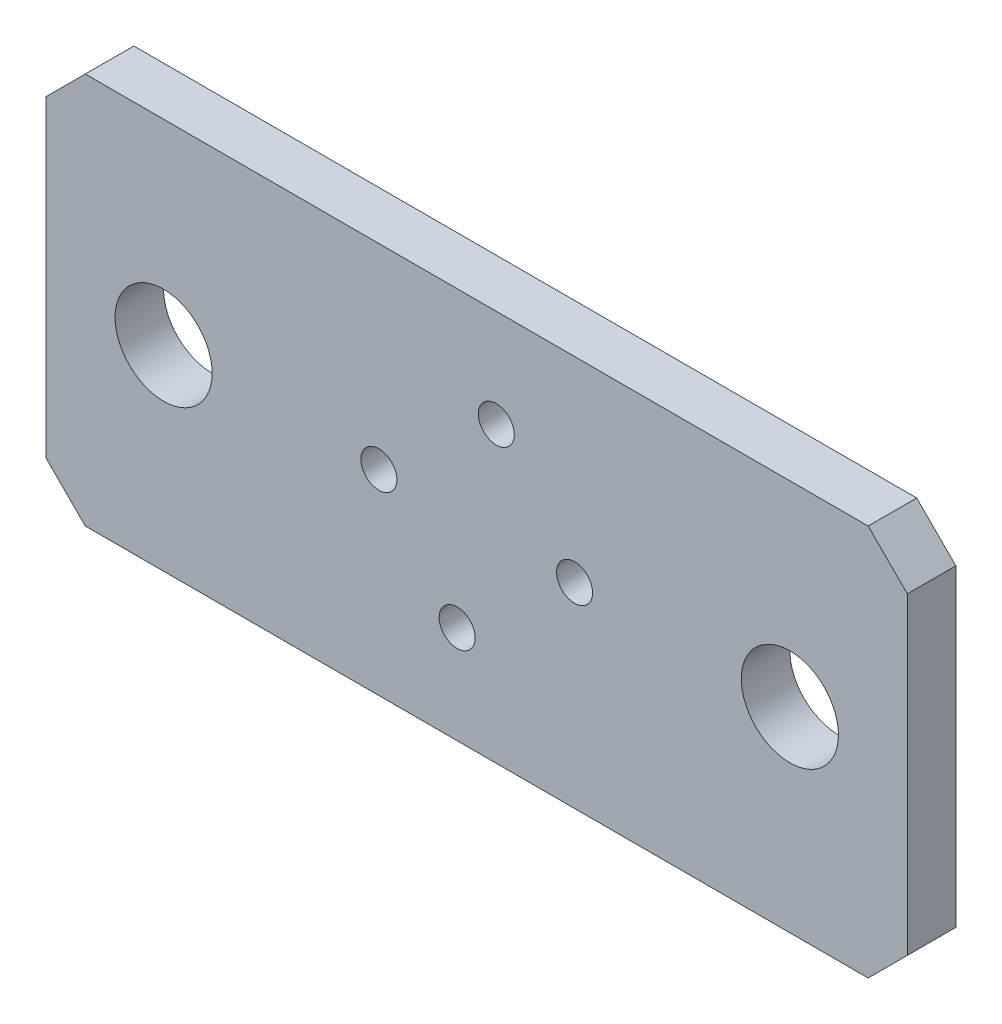
ISO-10303-21;
HEADER;
FILE_DESCRIPTION(('STEP AP214'),'2;1');
FILE_NAME('part.step','',(''),(''),'','','');
FILE_SCHEMA(('AUTOMOTIVE_DESIGN { 1 0 10303 214 1 1 1 1 }'));
ENDSEC;
DATA;
#1=APPLICATION_CONTEXT('core data for automotive mechanical design processes');
#2=APPLICATION_PROTOCOL_DEFINITION('international standard','automotive_design',2000,#1);
#3=PRODUCT_CONTEXT('',#1,'mechanical');
#4=PRODUCT('Part','Part','',(#3));
#5=PRODUCT_RELATED_PRODUCT_CATEGORY('part','',(#4));
#6=PRODUCT_DEFINITION_FORMATION('','',#4);
#7=PRODUCT_DEFINITION_CONTEXT('part definition',#1,'design');
#8=PRODUCT_DEFINITION('design','',#6,#7);
#9=PRODUCT_DEFINITION_SHAPE('','',#8);
#10=(LENGTH_UNIT() NAMED_UNIT(*) SI_UNIT(.MILLI.,.METRE.));
#11=(NAMED_UNIT(*) PLANE_ANGLE_UNIT() SI_UNIT($,.RADIAN.));
#12=(NAMED_UNIT(*) SI_UNIT($,.STERADIAN.) SOLID_ANGLE_UNIT());
#13=UNCERTAINTY_MEASURE_WITH_UNIT(LENGTH_MEASURE(1.E-05),#10,'distance_accuracy_value','');
#14=(GEOMETRIC_REPRESENTATION_CONTEXT(3) GLOBAL_UNCERTAINTY_ASSIGNED_CONTEXT((#13)) GLOBAL_UNIT_ASSIGNED_CONTEXT((#10,
#11,#12)) REPRESENTATION_CONTEXT('',''));
#15=CARTESIAN_POINT('',(0.,0.,0.));
#16=DIRECTION('',(0.,0.,1.));
#17=DIRECTION('',(1.,0.,0.));
#18=AXIS2_PLACEMENT_3D('',#15,#16,#17);
#19=CARTESIAN_POINT('',(0.,0.,1.5748));
#20=DIRECTION('',(0.,0.,-1.));
#21=DIRECTION('',(-1.,0.,0.));
#22=AXIS2_PLACEMENT_3D('',#19,#20,#21);
#23=PLANE('',#22);
#24=DIRECTION('',(0.,-1.,0.));
#25=VECTOR('',#24,1.);
#26=CARTESIAN_POINT('',(0.,1.27,1.5748));
#27=LINE('',#26,#25);
#28=CARTESIAN_POINT('',(0.,11.43,1.5748));
#29=VERTEX_POINT('',#28);
#30=CARTESIAN_POINT('',(0.,1.27,1.5748));
#31=VERTEX_POINT('',#30);
#32=EDGE_CURVE('E144',#29,#31,#27,.T.);
#33=ORIENTED_EDGE('',*,*,#32,.T.);
#34=DIRECTION('',(0.707106781186548,-0.707106781186548,0.));
#35=VECTOR('',#34,1.);
#36=CARTESIAN_POINT('',(1.27,0.,1.5748));
#37=LINE('',#36,#35);
#38=CARTESIAN_POINT('',(1.27,0.,1.5748));
#39=VERTEX_POINT('',#38);
#40=EDGE_CURVE('E92',#31,#39,#37,.T.);
#41=ORIENTED_EDGE('',*,*,#40,.T.);
#42=DIRECTION('',(1.,0.,0.));
#43=VECTOR('',#42,1.);
#44=CARTESIAN_POINT('',(26.67,0.,1.5748));
#45=LINE('',#44,#43);
#46=CARTESIAN_POINT('',(26.67,0.,1.5748));
#47=VERTEX_POINT('',#46);
#48=EDGE_CURVE('E159',#39,#47,#45,.T.);
#49=ORIENTED_EDGE('',*,*,#48,.T.);
#50=DIRECTION('',(0.707106781186548,0.707106781186547,0.));
#51=VECTOR('',#50,1.);
#52=CARTESIAN_POINT('',(27.94,1.27,1.5748));
#53=LINE('',#52,#51);
#54=CARTESIAN_POINT('',(27.94,1.27,1.5748));
#55=VERTEX_POINT('',#54);
#56=EDGE_CURVE('E172',#47,#55,#53,.T.);
#57=ORIENTED_EDGE('',*,*,#56,.T.);
#58=DIRECTION('',(0.,1.,0.));
#59=VECTOR('',#58,1.);
#60=CARTESIAN_POINT('',(27.94,11.43,1.5748));
#61=LINE('',#60,#59);
#62=CARTESIAN_POINT('',(27.94,11.43,1.5748));
#63=VERTEX_POINT('',#62);
#64=EDGE_CURVE('E111',#55,#63,#61,.T.);
#65=ORIENTED_EDGE('',*,*,#64,.T.);
#66=DIRECTION('',(-0.707106781186547,0.707106781186548,0.));
#67=VECTOR('',#66,1.);
#68=CARTESIAN_POINT('',(26.67,12.7,1.5748));
#69=LINE('',#68,#67);
#70=CARTESIAN_POINT('',(26.67,12.7,1.5748));
#71=VERTEX_POINT('',#70);
#72=EDGE_CURVE('E105',#63,#71,#69,.T.);
#73=ORIENTED_EDGE('',*,*,#72,.T.);
#74=DIRECTION('',(-1.,0.,0.));
#75=VECTOR('',#74,1.);
#76=CARTESIAN_POINT('',(1.27,12.7,1.5748));
#77=LINE('',#76,#75);
#78=CARTESIAN_POINT('',(1.27,12.7,1.5748));
#79=VERTEX_POINT('',#78);
#80=EDGE_CURVE('E109',#71,#79,#77,.T.);
#81=ORIENTED_EDGE('',*,*,#80,.T.);
#82=DIRECTION('',(-0.707106781186547,-0.707106781186548,0.));
#83=VECTOR('',#82,1.);
#84=CARTESIAN_POINT('',(0.,11.43,1.5748));
#85=LINE('',#84,#83);
#86=EDGE_CURVE('E49',#79,#29,#85,.T.);
#87=ORIENTED_EDGE('',*,*,#86,.T.);
#88=EDGE_LOOP('',(#33,#41,#49,#57,#65,#73,#81,#87));
#89=FACE_BOUND('',#88,.T.);
#90=CARTESIAN_POINT('',(10.795,6.35,1.5748));
#91=DIRECTION('',(0.,0.,1.));
#92=DIRECTION('',(1.,0.,0.));
#93=AXIS2_PLACEMENT_3D('',#90,#91,#92);
#94=CIRCLE('',#93,0.5842);
#95=CARTESIAN_POINT('',(11.3792,6.35,1.5748));
#96=VERTEX_POINT('',#95);
#97=EDGE_CURVE('E133',#96,#96,#94,.T.);
#98=ORIENTED_EDGE('',*,*,#97,.F.);
#99=EDGE_LOOP('',(#98));
#100=FACE_BOUND('',#99,.T.);
#101=CARTESIAN_POINT('',(17.145,6.35,1.5748));
#102=DIRECTION('',(0.,0.,1.));
#103=DIRECTION('',(1.,0.,0.));
#104=AXIS2_PLACEMENT_3D('',#101,#102,#103);
#105=CIRCLE('',#104,0.5842);
#106=CARTESIAN_POINT('',(17.7292,6.35,1.5748));
#107=VERTEX_POINT('',#106);
#108=EDGE_CURVE('E181',#107,#107,#105,.T.);
#109=ORIENTED_EDGE('',*,*,#108,.F.);
#110=EDGE_LOOP('',(#109));
#111=FACE_BOUND('',#110,.T.);
#112=CARTESIAN_POINT('',(3.81,6.35,1.5748));
#113=DIRECTION('',(0.,0.,1.));
#114=DIRECTION('',(1.,0.,0.));
#115=AXIS2_PLACEMENT_3D('',#112,#113,#114);
#116=CIRCLE('',#115,1.5748);
#117=CARTESIAN_POINT('',(5.3848,6.35,1.5748));
#118=VERTEX_POINT('',#117);
#119=EDGE_CURVE('E187',#118,#118,#116,.T.);
#120=ORIENTED_EDGE('',*,*,#119,.F.);
#121=EDGE_LOOP('',(#120));
#122=FACE_BOUND('',#121,.T.);
#123=CARTESIAN_POINT('',(24.13,6.35,1.5748));
#124=DIRECTION('',(0.,0.,1.));
#125=DIRECTION('',(1.,0.,0.));
#126=AXIS2_PLACEMENT_3D('',#123,#124,#125);
#127=CIRCLE('',#126,1.5748);
#128=CARTESIAN_POINT('',(25.7048,6.35,1.5748));
#129=VERTEX_POINT('',#128);
#130=EDGE_CURVE('E193',#129,#129,#127,.T.);
#131=ORIENTED_EDGE('',*,*,#130,.F.);
#132=EDGE_LOOP('',(#131));
#133=FACE_BOUND('',#132,.T.);
#134=CARTESIAN_POINT('',(13.335,3.175,1.5748));
#135=DIRECTION('',(0.,0.,1.));
#136=DIRECTION('',(1.,0.,0.));
#137=AXIS2_PLACEMENT_3D('',#134,#135,#136);
#138=CIRCLE('',#137,0.5842);
#139=CARTESIAN_POINT('',(13.9192,3.175,1.5748));
#140=VERTEX_POINT('',#139);
#141=EDGE_CURVE('E199',#140,#140,#138,.T.);
#142=ORIENTED_EDGE('',*,*,#141,.F.);
#143=EDGE_LOOP('',(#142));
#144=FACE_BOUND('',#143,.T.);
#145=CARTESIAN_POINT('',(14.605,9.525,1.5748));
#146=DIRECTION('',(0.,0.,1.));
#147=DIRECTION('',(1.,0.,0.));
#148=AXIS2_PLACEMENT_3D('',#145,#146,#147);
#149=CIRCLE('',#148,0.5842);
#150=CARTESIAN_POINT('',(15.1892,9.525,1.5748));
#151=VERTEX_POINT('',#150);
#152=EDGE_CURVE('E205',#151,#151,#149,.T.);
#153=ORIENTED_EDGE('',*,*,#152,.F.);
#154=EDGE_LOOP('',(#153));
#155=FACE_BOUND('',#154,.T.);
#156=ADVANCED_FACE('F32',(#89,#100,#111,#122,#133,#144,#155),#23,.F.);
#157=CARTESIAN_POINT('',(0.,0.,0.));
#158=DIRECTION('',(0.,0.,-1.));
#159=DIRECTION('',(-1.,0.,0.));
#160=AXIS2_PLACEMENT_3D('',#157,#158,#159);
#161=PLANE('',#160);
#162=CARTESIAN_POINT('',(13.335,3.175,0.));
#163=DIRECTION('',(0.,0.,1.));
#164=DIRECTION('',(1.,0.,0.));
#165=AXIS2_PLACEMENT_3D('',#162,#163,#164);
#166=CIRCLE('',#165,0.5842);
#167=CARTESIAN_POINT('',(13.9192,3.175,0.));
#168=VERTEX_POINT('',#167);
#169=EDGE_CURVE('E202',#168,#168,#166,.T.);
#170=ORIENTED_EDGE('',*,*,#169,.T.);
#171=EDGE_LOOP('',(#170));
#172=FACE_BOUND('',#171,.T.);
#173=CARTESIAN_POINT('',(3.81,6.35,0.));
#174=DIRECTION('',(0.,0.,1.));
#175=DIRECTION('',(1.,0.,0.));
#176=AXIS2_PLACEMENT_3D('',#173,#174,#175);
#177=CIRCLE('',#176,1.5748);
#178=CARTESIAN_POINT('',(5.3848,6.35,0.));
#179=VERTEX_POINT('',#178);
#180=EDGE_CURVE('E190',#179,#179,#177,.T.);
#181=ORIENTED_EDGE('',*,*,#180,.T.);
#182=EDGE_LOOP('',(#181));
#183=FACE_BOUND('',#182,.T.);
#184=CARTESIAN_POINT('',(10.795,6.35,0.));
#185=DIRECTION('',(0.,0.,1.));
#186=DIRECTION('',(1.,0.,0.));
#187=AXIS2_PLACEMENT_3D('',#184,#185,#186);
#188=CIRCLE('',#187,0.5842);
#189=CARTESIAN_POINT('',(11.3792,6.35,0.));
#190=VERTEX_POINT('',#189);
#191=EDGE_CURVE('E178',#190,#190,#188,.T.);
#192=ORIENTED_EDGE('',*,*,#191,.T.);
#193=EDGE_LOOP('',(#192));
#194=FACE_BOUND('',#193,.T.);
#195=DIRECTION('',(0.,-1.,0.));
#196=VECTOR('',#195,1.);
#197=CARTESIAN_POINT('',(0.,1.27,0.));
#198=LINE('',#197,#196);
#199=CARTESIAN_POINT('',(0.,11.43,0.));
#200=VERTEX_POINT('',#199);
#201=CARTESIAN_POINT('',(0.,1.27,0.));
#202=VERTEX_POINT('',#201);
#203=EDGE_CURVE('E129',#200,#202,#198,.T.);
#204=ORIENTED_EDGE('',*,*,#203,.F.);
#205=DIRECTION('',(-0.707106781186547,-0.707106781186548,0.));
#206=VECTOR('',#205,1.);
#207=CARTESIAN_POINT('',(0.,11.43,0.));
#208=LINE('',#207,#206);
#209=CARTESIAN_POINT('',(1.27,12.7,0.));
#210=VERTEX_POINT('',#209);
#211=EDGE_CURVE('E84',#210,#200,#208,.T.);
#212=ORIENTED_EDGE('',*,*,#211,.F.);
#213=DIRECTION('',(-1.,0.,0.));
#214=VECTOR('',#213,1.);
#215=CARTESIAN_POINT('',(1.27,12.7,0.));
#216=LINE('',#215,#214);
#217=CARTESIAN_POINT('',(26.67,12.7,0.));
#218=VERTEX_POINT('',#217);
#219=EDGE_CURVE('E78',#218,#210,#216,.T.);
#220=ORIENTED_EDGE('',*,*,#219,.F.);
#221=DIRECTION('',(-0.707106781186547,0.707106781186548,0.));
#222=VECTOR('',#221,1.);
#223=CARTESIAN_POINT('',(26.67,12.7,0.));
#224=LINE('',#223,#222);
#225=CARTESIAN_POINT('',(27.94,11.43,0.));
#226=VERTEX_POINT('',#225);
#227=EDGE_CURVE('E119',#226,#218,#224,.T.);
#228=ORIENTED_EDGE('',*,*,#227,.F.);
#229=DIRECTION('',(0.,1.,0.));
#230=VECTOR('',#229,1.);
#231=CARTESIAN_POINT('',(27.94,11.43,0.));
#232=LINE('',#231,#230);
#233=CARTESIAN_POINT('',(27.94,1.27,0.));
#234=VERTEX_POINT('',#233);
#235=EDGE_CURVE('E139',#234,#226,#232,.T.);
#236=ORIENTED_EDGE('',*,*,#235,.F.);
#237=DIRECTION('',(0.707106781186548,0.707106781186547,0.));
#238=VECTOR('',#237,1.);
#239=CARTESIAN_POINT('',(27.94,1.27,0.));
#240=LINE('',#239,#238);
#241=CARTESIAN_POINT('',(26.67,0.,0.));
#242=VERTEX_POINT('',#241);
#243=EDGE_CURVE('E137',#242,#234,#240,.T.);
#244=ORIENTED_EDGE('',*,*,#243,.F.);
#245=DIRECTION('',(1.,0.,0.));
#246=VECTOR('',#245,1.);
#247=CARTESIAN_POINT('',(26.67,0.,0.));
#248=LINE('',#247,#246);
#249=CARTESIAN_POINT('',(1.27,0.,0.));
#250=VERTEX_POINT('',#249);
#251=EDGE_CURVE('E135',#250,#242,#248,.T.);
#252=ORIENTED_EDGE('',*,*,#251,.F.);
#253=DIRECTION('',(0.707106781186548,-0.707106781186548,0.));
#254=VECTOR('',#253,1.);
#255=CARTESIAN_POINT('',(1.27,0.,0.));
#256=LINE('',#255,#254);
#257=EDGE_CURVE('E132',#202,#250,#256,.T.);
#258=ORIENTED_EDGE('',*,*,#257,.F.);
#259=EDGE_LOOP('',(#204,#212,#220,#228,#236,#244,#252,#258));
#260=FACE_BOUND('',#259,.T.);
#261=CARTESIAN_POINT('',(17.145,6.35,0.));
#262=DIRECTION('',(0.,0.,1.));
#263=DIRECTION('',(1.,0.,0.));
#264=AXIS2_PLACEMENT_3D('',#261,#262,#263);
#265=CIRCLE('',#264,0.5842);
#266=CARTESIAN_POINT('',(17.7292,6.35,0.));
#267=VERTEX_POINT('',#266);
#268=EDGE_CURVE('E184',#267,#267,#265,.T.);
#269=ORIENTED_EDGE('',*,*,#268,.T.);
#270=EDGE_LOOP('',(#269));
#271=FACE_BOUND('',#270,.T.);
#272=CARTESIAN_POINT('',(24.13,6.35,0.));
#273=DIRECTION('',(0.,0.,1.));
#274=DIRECTION('',(1.,0.,0.));
#275=AXIS2_PLACEMENT_3D('',#272,#273,#274);
#276=CIRCLE('',#275,1.5748);
#277=CARTESIAN_POINT('',(25.7048,6.35,0.));
#278=VERTEX_POINT('',#277);
#279=EDGE_CURVE('E196',#278,#278,#276,.T.);
#280=ORIENTED_EDGE('',*,*,#279,.T.);
#281=EDGE_LOOP('',(#280));
#282=FACE_BOUND('',#281,.T.);
#283=CARTESIAN_POINT('',(14.605,9.525,0.));
#284=DIRECTION('',(0.,0.,1.));
#285=DIRECTION('',(1.,0.,0.));
#286=AXIS2_PLACEMENT_3D('',#283,#284,#285);
#287=CIRCLE('',#286,0.5842);
#288=CARTESIAN_POINT('',(15.1892,9.525,0.));
#289=VERTEX_POINT('',#288);
#290=EDGE_CURVE('E208',#289,#289,#287,.T.);
#291=ORIENTED_EDGE('',*,*,#290,.T.);
#292=EDGE_LOOP('',(#291));
#293=FACE_BOUND('',#292,.T.);
#294=ADVANCED_FACE('F163',(#172,#183,#194,#260,#271,#282,#293),#161,.T.);
#295=CARTESIAN_POINT('',(0.,1.27,1.5748));
#296=DIRECTION('',(1.,0.,0.));
#297=DIRECTION('',(0.,0.,-1.));
#298=AXIS2_PLACEMENT_3D('',#295,#296,#297);
#299=PLANE('',#298);
#300=ORIENTED_EDGE('',*,*,#203,.T.);
#301=DIRECTION('',(0.,0.,-1.));
#302=VECTOR('',#301,1.);
#303=CARTESIAN_POINT('',(0.,1.27,1.5748));
#304=LINE('',#303,#302);
#305=EDGE_CURVE('E11',#31,#202,#304,.T.);
#306=ORIENTED_EDGE('',*,*,#305,.F.);
#307=ORIENTED_EDGE('',*,*,#32,.F.);
#308=DIRECTION('',(0.,0.,-1.));
#309=VECTOR('',#308,1.);
#310=CARTESIAN_POINT('',(0.,11.43,1.5748));
#311=LINE('',#310,#309);
#312=EDGE_CURVE('E125',#29,#200,#311,.T.);
#313=ORIENTED_EDGE('',*,*,#312,.T.);
#314=EDGE_LOOP('',(#300,#306,#307,#313));
#315=FACE_BOUND('',#314,.T.);
#316=ADVANCED_FACE('F34',(#315),#299,.F.);
#317=CARTESIAN_POINT('',(1.27,0.,1.5748));
#318=DIRECTION('',(0.707106781186548,0.707106781186548,0.));
#319=DIRECTION('',(-0.707106781186548,0.707106781186548,0.));
#320=AXIS2_PLACEMENT_3D('',#317,#318,#319);
#321=PLANE('',#320);
#322=ORIENTED_EDGE('',*,*,#257,.T.);
#323=DIRECTION('',(0.,0.,-1.));
#324=VECTOR('',#323,1.);
#325=CARTESIAN_POINT('',(1.27,0.,1.5748));
#326=LINE('',#325,#324);
#327=EDGE_CURVE('E41',#39,#250,#326,.T.);
#328=ORIENTED_EDGE('',*,*,#327,.F.);
#329=ORIENTED_EDGE('',*,*,#40,.F.);
#330=ORIENTED_EDGE('',*,*,#305,.T.);
#331=EDGE_LOOP('',(#322,#328,#329,#330));
#332=FACE_BOUND('',#331,.T.);
#333=ADVANCED_FACE('F240',(#332),#321,.F.);
#334=CARTESIAN_POINT('',(26.67,0.,1.5748));
#335=DIRECTION('',(0.,1.,0.));
#336=DIRECTION('',(0.,0.,1.));
#337=AXIS2_PLACEMENT_3D('',#334,#335,#336);
#338=PLANE('',#337);
#339=ORIENTED_EDGE('',*,*,#251,.T.);
#340=DIRECTION('',(0.,0.,-1.));
#341=VECTOR('',#340,1.);
#342=CARTESIAN_POINT('',(26.67,0.,1.5748));
#343=LINE('',#342,#341);
#344=EDGE_CURVE('E151',#47,#242,#343,.T.);
#345=ORIENTED_EDGE('',*,*,#344,.F.);
#346=ORIENTED_EDGE('',*,*,#48,.F.);
#347=ORIENTED_EDGE('',*,*,#327,.T.);
#348=EDGE_LOOP('',(#339,#345,#346,#347));
#349=FACE_BOUND('',#348,.T.);
#350=ADVANCED_FACE('F157',(#349),#338,.F.);
#351=CARTESIAN_POINT('',(27.94,1.27,1.5748));
#352=DIRECTION('',(-0.707106781186548,0.707106781186548,0.));
#353=DIRECTION('',(-0.707106781186548,-0.707106781186548,0.));
#354=AXIS2_PLACEMENT_3D('',#351,#352,#353);
#355=PLANE('',#354);
#356=ORIENTED_EDGE('',*,*,#243,.T.);
#357=DIRECTION('',(0.,0.,-1.));
#358=VECTOR('',#357,1.);
#359=CARTESIAN_POINT('',(27.94,1.27,1.5748));
#360=LINE('',#359,#358);
#361=EDGE_CURVE('E148',#55,#234,#360,.T.);
#362=ORIENTED_EDGE('',*,*,#361,.F.);
#363=ORIENTED_EDGE('',*,*,#56,.F.);
#364=ORIENTED_EDGE('',*,*,#344,.T.);
#365=EDGE_LOOP('',(#356,#362,#363,#364));
#366=FACE_BOUND('',#365,.T.);
#367=ADVANCED_FACE('F168',(#366),#355,.F.);
#368=CARTESIAN_POINT('',(27.94,11.43,1.5748));
#369=DIRECTION('',(-1.,0.,0.));
#370=DIRECTION('',(0.,0.,1.));
#371=AXIS2_PLACEMENT_3D('',#368,#369,#370);
#372=PLANE('',#371);
#373=ORIENTED_EDGE('',*,*,#235,.T.);
#374=DIRECTION('',(0.,0.,-1.));
#375=VECTOR('',#374,1.);
#376=CARTESIAN_POINT('',(27.94,11.43,1.5748));
#377=LINE('',#376,#375);
#378=EDGE_CURVE('E120',#63,#226,#377,.T.);
#379=ORIENTED_EDGE('',*,*,#378,.F.);
#380=ORIENTED_EDGE('',*,*,#64,.F.);
#381=ORIENTED_EDGE('',*,*,#361,.T.);
#382=EDGE_LOOP('',(#373,#379,#380,#381));
#383=FACE_BOUND('',#382,.T.);
#384=ADVANCED_FACE('F171',(#383),#372,.F.);
#385=CARTESIAN_POINT('',(26.67,12.7,1.5748));
#386=DIRECTION('',(-0.707106781186548,-0.707106781186547,0.));
#387=DIRECTION('',(0.707106781186547,-0.707106781186548,0.));
#388=AXIS2_PLACEMENT_3D('',#385,#386,#387);
#389=PLANE('',#388);
#390=ORIENTED_EDGE('',*,*,#227,.T.);
#391=DIRECTION('',(0.,0.,-1.));
#392=VECTOR('',#391,1.);
#393=CARTESIAN_POINT('',(26.67,12.7,1.5748));
#394=LINE('',#393,#392);
#395=EDGE_CURVE('E116',#71,#218,#394,.T.);
#396=ORIENTED_EDGE('',*,*,#395,.F.);
#397=ORIENTED_EDGE('',*,*,#72,.F.);
#398=ORIENTED_EDGE('',*,*,#378,.T.);
#399=EDGE_LOOP('',(#390,#396,#397,#398));
#400=FACE_BOUND('',#399,.T.);
#401=ADVANCED_FACE('F117',(#400),#389,.F.);
#402=CARTESIAN_POINT('',(1.27,12.7,1.5748));
#403=DIRECTION('',(0.,-1.,0.));
#404=DIRECTION('',(0.,0.,-1.));
#405=AXIS2_PLACEMENT_3D('',#402,#403,#404);
#406=PLANE('',#405);
#407=ORIENTED_EDGE('',*,*,#219,.T.);
#408=DIRECTION('',(0.,0.,-1.));
#409=VECTOR('',#408,1.);
#410=CARTESIAN_POINT('',(1.27,12.7,1.5748));
#411=LINE('',#410,#409);
#412=EDGE_CURVE('E121',#79,#210,#411,.T.);
#413=ORIENTED_EDGE('',*,*,#412,.F.);
#414=ORIENTED_EDGE('',*,*,#80,.F.);
#415=ORIENTED_EDGE('',*,*,#395,.T.);
#416=EDGE_LOOP('',(#407,#413,#414,#415));
#417=FACE_BOUND('',#416,.T.);
#418=ADVANCED_FACE('F123',(#417),#406,.F.);
#419=CARTESIAN_POINT('',(0.,11.43,1.5748));
#420=DIRECTION('',(0.707106781186548,-0.707106781186547,0.));
#421=DIRECTION('',(0.707106781186547,0.707106781186548,0.));
#422=AXIS2_PLACEMENT_3D('',#419,#420,#421);
#423=PLANE('',#422);
#424=ORIENTED_EDGE('',*,*,#211,.T.);
#425=ORIENTED_EDGE('',*,*,#312,.F.);
#426=ORIENTED_EDGE('',*,*,#86,.F.);
#427=ORIENTED_EDGE('',*,*,#412,.T.);
#428=EDGE_LOOP('',(#424,#425,#426,#427));
#429=FACE_BOUND('',#428,.T.);
#430=ADVANCED_FACE('F228',(#429),#423,.F.);
#431=CARTESIAN_POINT('',(10.795,6.35,1.5748));
#432=DIRECTION('',(0.,0.,-1.));
#433=DIRECTION('',(-1.,0.,0.));
#434=AXIS2_PLACEMENT_3D('',#431,#432,#433);
#435=CYLINDRICAL_SURFACE('',#434,0.5842);
#436=ORIENTED_EDGE('',*,*,#97,.T.);
#437=EDGE_LOOP('',(#436));
#438=FACE_BOUND('',#437,.T.);
#439=ORIENTED_EDGE('',*,*,#191,.F.);
#440=EDGE_LOOP('',(#439));
#441=FACE_BOUND('',#440,.T.);
#442=ADVANCED_FACE('F225',(#438,#441),#435,.F.);
#443=CARTESIAN_POINT('',(17.145,6.35,1.5748));
#444=DIRECTION('',(0.,0.,-1.));
#445=DIRECTION('',(-1.,0.,0.));
#446=AXIS2_PLACEMENT_3D('',#443,#444,#445);
#447=CYLINDRICAL_SURFACE('',#446,0.5842);
#448=ORIENTED_EDGE('',*,*,#108,.T.);
#449=EDGE_LOOP('',(#448));
#450=FACE_BOUND('',#449,.T.);
#451=ORIENTED_EDGE('',*,*,#268,.F.);
#452=EDGE_LOOP('',(#451));
#453=FACE_BOUND('',#452,.T.);
#454=ADVANCED_FACE('F304',(#450,#453),#447,.F.);
#455=CARTESIAN_POINT('',(3.81,6.35,1.5748));
#456=DIRECTION('',(0.,0.,-1.));
#457=DIRECTION('',(-1.,0.,0.));
#458=AXIS2_PLACEMENT_3D('',#455,#456,#457);
#459=CYLINDRICAL_SURFACE('',#458,1.5748);
#460=ORIENTED_EDGE('',*,*,#119,.T.);
#461=EDGE_LOOP('',(#460));
#462=FACE_BOUND('',#461,.T.);
#463=ORIENTED_EDGE('',*,*,#180,.F.);
#464=EDGE_LOOP('',(#463));
#465=FACE_BOUND('',#464,.T.);
#466=ADVANCED_FACE('F312',(#462,#465),#459,.F.);
#467=CARTESIAN_POINT('',(24.13,6.35,1.5748));
#468=DIRECTION('',(0.,0.,-1.));
#469=DIRECTION('',(-1.,0.,0.));
#470=AXIS2_PLACEMENT_3D('',#467,#468,#469);
#471=CYLINDRICAL_SURFACE('',#470,1.5748);
#472=ORIENTED_EDGE('',*,*,#130,.T.);
#473=EDGE_LOOP('',(#472));
#474=FACE_BOUND('',#473,.T.);
#475=ORIENTED_EDGE('',*,*,#279,.F.);
#476=EDGE_LOOP('',(#475));
#477=FACE_BOUND('',#476,.T.);
#478=ADVANCED_FACE('F320',(#474,#477),#471,.F.);
#479=CARTESIAN_POINT('',(13.335,3.175,1.5748));
#480=DIRECTION('',(0.,0.,-1.));
#481=DIRECTION('',(-1.,0.,0.));
#482=AXIS2_PLACEMENT_3D('',#479,#480,#481);
#483=CYLINDRICAL_SURFACE('',#482,0.5842);
#484=ORIENTED_EDGE('',*,*,#141,.T.);
#485=EDGE_LOOP('',(#484));
#486=FACE_BOUND('',#485,.T.);
#487=ORIENTED_EDGE('',*,*,#169,.F.);
#488=EDGE_LOOP('',(#487));
#489=FACE_BOUND('',#488,.T.);
#490=ADVANCED_FACE('F329',(#486,#489),#483,.F.);
#491=CARTESIAN_POINT('',(14.605,9.525,1.5748));
#492=DIRECTION('',(0.,0.,-1.));
#493=DIRECTION('',(-1.,0.,0.));
#494=AXIS2_PLACEMENT_3D('',#491,#492,#493);
#495=CYLINDRICAL_SURFACE('',#494,0.5842);
#496=ORIENTED_EDGE('',*,*,#152,.T.);
#497=EDGE_LOOP('',(#496));
#498=FACE_BOUND('',#497,.T.);
#499=ORIENTED_EDGE('',*,*,#290,.F.);
#500=EDGE_LOOP('',(#499));
#501=FACE_BOUND('',#500,.T.);
#502=ADVANCED_FACE('F214',(#498,#501),#495,.F.);
#503=CLOSED_SHELL('',(#156,#294,#316,#333,#350,#367,#384,#401,#418,#430,#442,#454,#466,#478,
#490,#502));
#504=MANIFOLD_SOLID_BREP('B2',#503);
#505=ADVANCED_BREP_SHAPE_REPRESENTATION('',(#18,#504),#14);
#506=SHAPE_DEFINITION_REPRESENTATION(#9,#505);
ENDSEC;
END-ISO-10303-21;
